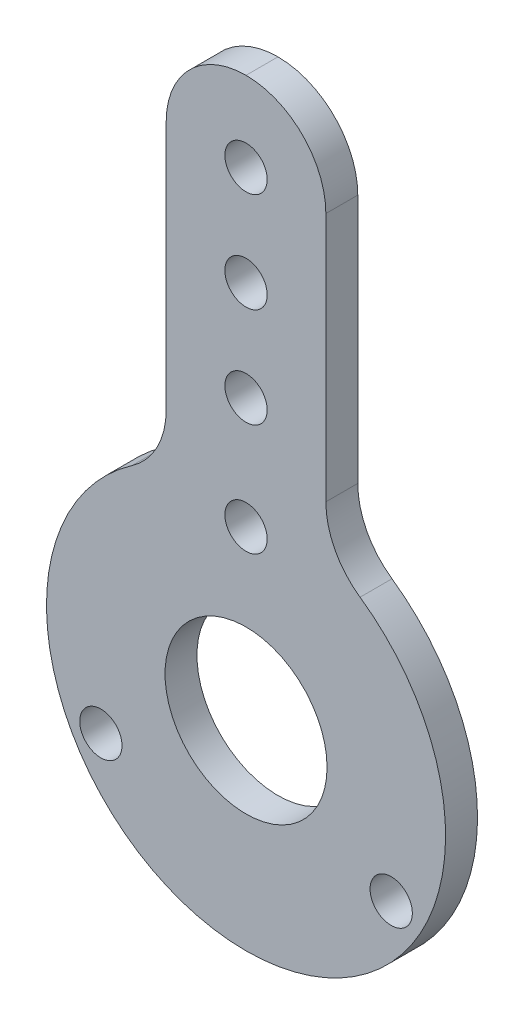
ISO-10303-21;
HEADER;
FILE_DESCRIPTION(('STEP AP214'),'2;1');
FILE_NAME('part.step','',(''),(''),'','','');
FILE_SCHEMA(('AUTOMOTIVE_DESIGN { 1 0 10303 214 1 1 1 1 }'));
ENDSEC;
DATA;
#1=APPLICATION_CONTEXT('core data for automotive mechanical design processes');
#2=APPLICATION_PROTOCOL_DEFINITION('international standard','automotive_design',2000,#1);
#3=PRODUCT_CONTEXT('',#1,'mechanical');
#4=PRODUCT('Part','Part','',(#3));
#5=PRODUCT_RELATED_PRODUCT_CATEGORY('part','',(#4));
#6=PRODUCT_DEFINITION_FORMATION('','',#4);
#7=PRODUCT_DEFINITION_CONTEXT('part definition',#1,'design');
#8=PRODUCT_DEFINITION('design','',#6,#7);
#9=PRODUCT_DEFINITION_SHAPE('','',#8);
#10=(LENGTH_UNIT() NAMED_UNIT(*) SI_UNIT(.MILLI.,.METRE.));
#11=(NAMED_UNIT(*) PLANE_ANGLE_UNIT() SI_UNIT($,.RADIAN.));
#12=(NAMED_UNIT(*) SI_UNIT($,.STERADIAN.) SOLID_ANGLE_UNIT());
#13=UNCERTAINTY_MEASURE_WITH_UNIT(LENGTH_MEASURE(1.E-05),#10,'distance_accuracy_value','');
#14=(GEOMETRIC_REPRESENTATION_CONTEXT(3) GLOBAL_UNCERTAINTY_ASSIGNED_CONTEXT((#13)) GLOBAL_UNIT_ASSIGNED_CONTEXT((#10,
#11,#12)) REPRESENTATION_CONTEXT('',''));
#15=CARTESIAN_POINT('',(0.,0.,0.));
#16=DIRECTION('',(0.,0.,1.));
#17=DIRECTION('',(1.,0.,0.));
#18=AXIS2_PLACEMENT_3D('',#15,#16,#17);
#19=CARTESIAN_POINT('',(0.,0.,4.));
#20=DIRECTION('',(0.,0.,1.));
#21=DIRECTION('',(1.,0.,0.));
#22=AXIS2_PLACEMENT_3D('',#19,#20,#21);
#23=PLANE('',#22);
#24=CARTESIAN_POINT('',(0.,60.,4.));
#25=DIRECTION('',(0.,0.,1.));
#26=DIRECTION('',(1.,0.,0.));
#27=AXIS2_PLACEMENT_3D('',#24,#25,#26);
#28=CIRCLE('',#27,2.65);
#29=CARTESIAN_POINT('',(2.65,60.,4.));
#30=VERTEX_POINT('',#29);
#31=EDGE_CURVE('E188',#30,#30,#28,.T.);
#32=ORIENTED_EDGE('',*,*,#31,.F.);
#33=EDGE_LOOP('',(#32));
#34=FACE_BOUND('',#33,.T.);
#35=CARTESIAN_POINT('',(-18.1865334794719,-10.5000000000007,4.));
#36=DIRECTION('',(0.,0.,1.));
#37=DIRECTION('',(1.,0.,0.));
#38=AXIS2_PLACEMENT_3D('',#35,#36,#37);
#39=CIRCLE('',#38,2.65);
#40=CARTESIAN_POINT('',(-15.5365334794719,-10.5000000000007,4.));
#41=VERTEX_POINT('',#40);
#42=EDGE_CURVE('E176',#41,#41,#39,.T.);
#43=ORIENTED_EDGE('',*,*,#42,.F.);
#44=EDGE_LOOP('',(#43));
#45=FACE_BOUND('',#44,.T.);
#46=CARTESIAN_POINT('',(0.,21.,4.));
#47=DIRECTION('',(0.,0.,1.));
#48=DIRECTION('',(1.,0.,0.));
#49=AXIS2_PLACEMENT_3D('',#46,#47,#48);
#50=CIRCLE('',#49,2.65);
#51=CARTESIAN_POINT('',(2.65,21.,4.));
#52=VERTEX_POINT('',#51);
#53=EDGE_CURVE('E164',#52,#52,#50,.T.);
#54=ORIENTED_EDGE('',*,*,#53,.F.);
#55=EDGE_LOOP('',(#54));
#56=FACE_BOUND('',#55,.T.);
#57=DIRECTION('',(0.,1.,0.));
#58=VECTOR('',#57,1.);
#59=CARTESIAN_POINT('',(10.,70.,4.));
#60=LINE('',#59,#58);
#61=CARTESIAN_POINT('',(10.,28.7228132326901,4.));
#62=VERTEX_POINT('',#61);
#63=CARTESIAN_POINT('',(10.,60.,4.));
#64=VERTEX_POINT('',#63);
#65=EDGE_CURVE('E115',#62,#64,#60,.T.);
#66=ORIENTED_EDGE('',*,*,#65,.T.);
#67=CARTESIAN_POINT('',(0.,60.,4.));
#68=DIRECTION('',(0.,0.,1.));
#69=DIRECTION('',(1.,0.,0.));
#70=AXIS2_PLACEMENT_3D('',#67,#68,#69);
#71=CIRCLE('',#70,10.);
#72=CARTESIAN_POINT('',(0.,70.,4.));
#73=VERTEX_POINT('',#72);
#74=EDGE_CURVE('E140',#64,#73,#71,.T.);
#75=ORIENTED_EDGE('',*,*,#74,.T.);
#76=CARTESIAN_POINT('',(0.,60.,4.));
#77=DIRECTION('',(0.,0.,1.));
#78=DIRECTION('',(1.,0.,0.));
#79=AXIS2_PLACEMENT_3D('',#76,#77,#78);
#80=CIRCLE('',#79,10.);
#81=CARTESIAN_POINT('',(-10.,60.,4.));
#82=VERTEX_POINT('',#81);
#83=EDGE_CURVE('E57',#73,#82,#80,.T.);
#84=ORIENTED_EDGE('',*,*,#83,.T.);
#85=DIRECTION('',(0.,-1.,0.));
#86=VECTOR('',#85,1.);
#87=CARTESIAN_POINT('',(-10.,70.,4.));
#88=LINE('',#87,#86);
#89=CARTESIAN_POINT('',(-10.,28.7228132326901,4.));
#90=VERTEX_POINT('',#89);
#91=EDGE_CURVE('E123',#82,#90,#88,.T.);
#92=ORIENTED_EDGE('',*,*,#91,.T.);
#93=CARTESIAN_POINT('',(-20.,28.7228132326901,4.));
#94=DIRECTION('',(0.,0.,1.));
#95=DIRECTION('',(1.,0.,0.));
#96=AXIS2_PLACEMENT_3D('',#93,#94,#95);
#97=CIRCLE('',#96,10.);
#98=CARTESIAN_POINT('',(-14.2857142857143,20.5162951662073,4.));
#99=VERTEX_POINT('',#98);
#100=EDGE_CURVE('E11',#90,#99,#97,.F.);
#101=ORIENTED_EDGE('',*,*,#100,.T.);
#102=CARTESIAN_POINT('',(0.,0.,4.));
#103=DIRECTION('',(0.,0.,1.));
#104=DIRECTION('',(1.,0.,0.));
#105=AXIS2_PLACEMENT_3D('',#102,#103,#104);
#106=CIRCLE('',#105,25.);
#107=CARTESIAN_POINT('',(14.2857142857143,20.5162951662073,4.));
#108=VERTEX_POINT('',#107);
#109=EDGE_CURVE('E126',#99,#108,#106,.T.);
#110=ORIENTED_EDGE('',*,*,#109,.T.);
#111=CARTESIAN_POINT('',(20.,28.7228132326901,4.));
#112=DIRECTION('',(0.,0.,1.));
#113=DIRECTION('',(1.,0.,0.));
#114=AXIS2_PLACEMENT_3D('',#111,#112,#113);
#115=CIRCLE('',#114,10.);
#116=EDGE_CURVE('E104',#108,#62,#115,.F.);
#117=ORIENTED_EDGE('',*,*,#116,.T.);
#118=EDGE_LOOP('',(#66,#75,#84,#92,#101,#110,#117));
#119=FACE_BOUND('',#118,.T.);
#120=CARTESIAN_POINT('',(0.,0.,4.));
#121=DIRECTION('',(0.,0.,1.));
#122=DIRECTION('',(1.,0.,0.));
#123=AXIS2_PLACEMENT_3D('',#120,#121,#122);
#124=CIRCLE('',#123,10.15);
#125=CARTESIAN_POINT('',(10.15,0.,4.));
#126=VERTEX_POINT('',#125);
#127=EDGE_CURVE('E151',#126,#126,#124,.T.);
#128=ORIENTED_EDGE('',*,*,#127,.F.);
#129=EDGE_LOOP('',(#128));
#130=FACE_BOUND('',#129,.T.);
#131=CARTESIAN_POINT('',(18.1865334794745,-10.4999999999993,4.));
#132=DIRECTION('',(0.,0.,1.));
#133=DIRECTION('',(1.,0.,0.));
#134=AXIS2_PLACEMENT_3D('',#131,#132,#133);
#135=CIRCLE('',#134,2.65);
#136=CARTESIAN_POINT('',(20.8365334794745,-10.4999999999993,4.));
#137=VERTEX_POINT('',#136);
#138=EDGE_CURVE('E170',#137,#137,#135,.T.);
#139=ORIENTED_EDGE('',*,*,#138,.F.);
#140=EDGE_LOOP('',(#139));
#141=FACE_BOUND('',#140,.T.);
#142=CARTESIAN_POINT('',(0.,35.,4.));
#143=DIRECTION('',(0.,0.,1.));
#144=DIRECTION('',(1.,0.,0.));
#145=AXIS2_PLACEMENT_3D('',#142,#143,#144);
#146=CIRCLE('',#145,2.65);
#147=CARTESIAN_POINT('',(2.65,35.,4.));
#148=VERTEX_POINT('',#147);
#149=EDGE_CURVE('E182',#148,#148,#146,.T.);
#150=ORIENTED_EDGE('',*,*,#149,.F.);
#151=EDGE_LOOP('',(#150));
#152=FACE_BOUND('',#151,.T.);
#153=CARTESIAN_POINT('',(0.,47.5,4.));
#154=DIRECTION('',(0.,0.,1.));
#155=DIRECTION('',(1.,0.,0.));
#156=AXIS2_PLACEMENT_3D('',#153,#154,#155);
#157=CIRCLE('',#156,2.65);
#158=CARTESIAN_POINT('',(2.65,47.5,4.));
#159=VERTEX_POINT('',#158);
#160=EDGE_CURVE('E194',#159,#159,#157,.T.);
#161=ORIENTED_EDGE('',*,*,#160,.F.);
#162=EDGE_LOOP('',(#161));
#163=FACE_BOUND('',#162,.T.);
#164=ADVANCED_FACE('F34',(#34,#45,#56,#119,#130,#141,#152,#163),#23,.T.);
#165=CARTESIAN_POINT('',(0.,0.,0.));
#166=DIRECTION('',(0.,0.,1.));
#167=DIRECTION('',(1.,0.,0.));
#168=AXIS2_PLACEMENT_3D('',#165,#166,#167);
#169=PLANE('',#168);
#170=CARTESIAN_POINT('',(0.,60.,0.));
#171=DIRECTION('',(0.,0.,1.));
#172=DIRECTION('',(1.,0.,0.));
#173=AXIS2_PLACEMENT_3D('',#170,#171,#172);
#174=CIRCLE('',#173,10.);
#175=CARTESIAN_POINT('',(-10.,60.,0.));
#176=VERTEX_POINT('',#175);
#177=CARTESIAN_POINT('',(0.,70.,0.));
#178=VERTEX_POINT('',#177);
#179=EDGE_CURVE('E136',#176,#178,#174,.F.);
#180=ORIENTED_EDGE('',*,*,#179,.T.);
#181=CARTESIAN_POINT('',(0.,60.,0.));
#182=DIRECTION('',(0.,0.,1.));
#183=DIRECTION('',(1.,0.,0.));
#184=AXIS2_PLACEMENT_3D('',#181,#182,#183);
#185=CIRCLE('',#184,10.);
#186=CARTESIAN_POINT('',(10.,60.,0.));
#187=VERTEX_POINT('',#186);
#188=EDGE_CURVE('E122',#178,#187,#185,.F.);
#189=ORIENTED_EDGE('',*,*,#188,.T.);
#190=DIRECTION('',(0.,1.,0.));
#191=VECTOR('',#190,1.);
#192=CARTESIAN_POINT('',(10.,70.,0.));
#193=LINE('',#192,#191);
#194=CARTESIAN_POINT('',(10.,28.7228132326901,0.));
#195=VERTEX_POINT('',#194);
#196=EDGE_CURVE('E112',#195,#187,#193,.T.);
#197=ORIENTED_EDGE('',*,*,#196,.F.);
#198=CARTESIAN_POINT('',(20.,28.7228132326901,0.));
#199=DIRECTION('',(0.,0.,1.));
#200=DIRECTION('',(1.,0.,0.));
#201=AXIS2_PLACEMENT_3D('',#198,#199,#200);
#202=CIRCLE('',#201,10.);
#203=CARTESIAN_POINT('',(14.2857142857143,20.5162951662073,0.));
#204=VERTEX_POINT('',#203);
#205=EDGE_CURVE('E94',#195,#204,#202,.T.);
#206=ORIENTED_EDGE('',*,*,#205,.T.);
#207=CARTESIAN_POINT('',(0.,0.,0.));
#208=DIRECTION('',(0.,0.,1.));
#209=DIRECTION('',(1.,0.,0.));
#210=AXIS2_PLACEMENT_3D('',#207,#208,#209);
#211=CIRCLE('',#210,25.);
#212=CARTESIAN_POINT('',(-14.2857142857143,20.5162951662073,0.));
#213=VERTEX_POINT('',#212);
#214=EDGE_CURVE('E124',#213,#204,#211,.T.);
#215=ORIENTED_EDGE('',*,*,#214,.F.);
#216=CARTESIAN_POINT('',(-20.,28.7228132326901,0.));
#217=DIRECTION('',(0.,0.,1.));
#218=DIRECTION('',(1.,0.,0.));
#219=AXIS2_PLACEMENT_3D('',#216,#217,#218);
#220=CIRCLE('',#219,10.);
#221=CARTESIAN_POINT('',(-10.,28.7228132326901,0.));
#222=VERTEX_POINT('',#221);
#223=EDGE_CURVE('E43',#213,#222,#220,.T.);
#224=ORIENTED_EDGE('',*,*,#223,.T.);
#225=DIRECTION('',(0.,-1.,0.));
#226=VECTOR('',#225,1.);
#227=CARTESIAN_POINT('',(-10.,70.,0.));
#228=LINE('',#227,#226);
#229=EDGE_CURVE('E128',#176,#222,#228,.T.);
#230=ORIENTED_EDGE('',*,*,#229,.F.);
#231=EDGE_LOOP('',(#180,#189,#197,#206,#215,#224,#230));
#232=FACE_BOUND('',#231,.T.);
#233=CARTESIAN_POINT('',(0.,0.,0.));
#234=DIRECTION('',(0.,0.,1.));
#235=DIRECTION('',(1.,0.,0.));
#236=AXIS2_PLACEMENT_3D('',#233,#234,#235);
#237=CIRCLE('',#236,10.15);
#238=CARTESIAN_POINT('',(10.15,0.,0.));
#239=VERTEX_POINT('',#238);
#240=EDGE_CURVE('E161',#239,#239,#237,.T.);
#241=ORIENTED_EDGE('',*,*,#240,.T.);
#242=EDGE_LOOP('',(#241));
#243=FACE_BOUND('',#242,.T.);
#244=CARTESIAN_POINT('',(0.,21.,0.));
#245=DIRECTION('',(0.,0.,1.));
#246=DIRECTION('',(1.,0.,0.));
#247=AXIS2_PLACEMENT_3D('',#244,#245,#246);
#248=CIRCLE('',#247,2.65);
#249=CARTESIAN_POINT('',(2.65,21.,0.));
#250=VERTEX_POINT('',#249);
#251=EDGE_CURVE('E167',#250,#250,#248,.T.);
#252=ORIENTED_EDGE('',*,*,#251,.T.);
#253=EDGE_LOOP('',(#252));
#254=FACE_BOUND('',#253,.T.);
#255=CARTESIAN_POINT('',(18.1865334794745,-10.4999999999993,0.));
#256=DIRECTION('',(0.,0.,1.));
#257=DIRECTION('',(1.,0.,0.));
#258=AXIS2_PLACEMENT_3D('',#255,#256,#257);
#259=CIRCLE('',#258,2.65);
#260=CARTESIAN_POINT('',(20.8365334794745,-10.4999999999993,0.));
#261=VERTEX_POINT('',#260);
#262=EDGE_CURVE('E173',#261,#261,#259,.T.);
#263=ORIENTED_EDGE('',*,*,#262,.T.);
#264=EDGE_LOOP('',(#263));
#265=FACE_BOUND('',#264,.T.);
#266=CARTESIAN_POINT('',(-18.1865334794719,-10.5000000000007,0.));
#267=DIRECTION('',(0.,0.,1.));
#268=DIRECTION('',(1.,0.,0.));
#269=AXIS2_PLACEMENT_3D('',#266,#267,#268);
#270=CIRCLE('',#269,2.65);
#271=CARTESIAN_POINT('',(-15.5365334794719,-10.5000000000007,0.));
#272=VERTEX_POINT('',#271);
#273=EDGE_CURVE('E179',#272,#272,#270,.T.);
#274=ORIENTED_EDGE('',*,*,#273,.T.);
#275=EDGE_LOOP('',(#274));
#276=FACE_BOUND('',#275,.T.);
#277=CARTESIAN_POINT('',(0.,35.,0.));
#278=DIRECTION('',(0.,0.,1.));
#279=DIRECTION('',(1.,0.,0.));
#280=AXIS2_PLACEMENT_3D('',#277,#278,#279);
#281=CIRCLE('',#280,2.65);
#282=CARTESIAN_POINT('',(2.65,35.,0.));
#283=VERTEX_POINT('',#282);
#284=EDGE_CURVE('E185',#283,#283,#281,.T.);
#285=ORIENTED_EDGE('',*,*,#284,.T.);
#286=EDGE_LOOP('',(#285));
#287=FACE_BOUND('',#286,.T.);
#288=CARTESIAN_POINT('',(0.,60.,0.));
#289=DIRECTION('',(0.,0.,1.));
#290=DIRECTION('',(1.,0.,0.));
#291=AXIS2_PLACEMENT_3D('',#288,#289,#290);
#292=CIRCLE('',#291,2.65);
#293=CARTESIAN_POINT('',(2.65,60.,0.));
#294=VERTEX_POINT('',#293);
#295=EDGE_CURVE('E191',#294,#294,#292,.T.);
#296=ORIENTED_EDGE('',*,*,#295,.T.);
#297=EDGE_LOOP('',(#296));
#298=FACE_BOUND('',#297,.T.);
#299=CARTESIAN_POINT('',(0.,47.5,0.));
#300=DIRECTION('',(0.,0.,1.));
#301=DIRECTION('',(1.,0.,0.));
#302=AXIS2_PLACEMENT_3D('',#299,#300,#301);
#303=CIRCLE('',#302,2.65);
#304=CARTESIAN_POINT('',(2.65,47.5,0.));
#305=VERTEX_POINT('',#304);
#306=EDGE_CURVE('E197',#305,#305,#303,.T.);
#307=ORIENTED_EDGE('',*,*,#306,.T.);
#308=EDGE_LOOP('',(#307));
#309=FACE_BOUND('',#308,.T.);
#310=ADVANCED_FACE('F119',(#232,#243,#254,#265,#276,#287,#298,#309),#169,.F.);
#311=CARTESIAN_POINT('',(-10.,70.,4.));
#312=DIRECTION('',(1.,0.,0.));
#313=DIRECTION('',(0.,0.,-1.));
#314=AXIS2_PLACEMENT_3D('',#311,#312,#313);
#315=PLANE('',#314);
#316=ORIENTED_EDGE('',*,*,#91,.F.);
#317=DIRECTION('',(0.,0.,-1.));
#318=VECTOR('',#317,1.);
#319=CARTESIAN_POINT('',(-10.,60.,4.));
#320=LINE('',#319,#318);
#321=EDGE_CURVE('E105',#82,#176,#320,.T.);
#322=ORIENTED_EDGE('',*,*,#321,.T.);
#323=ORIENTED_EDGE('',*,*,#229,.T.);
#324=DIRECTION('',(0.,0.,1.));
#325=VECTOR('',#324,1.);
#326=CARTESIAN_POINT('',(-10.,28.7228132326901,4.));
#327=LINE('',#326,#325);
#328=EDGE_CURVE('E50',#222,#90,#327,.T.);
#329=ORIENTED_EDGE('',*,*,#328,.T.);
#330=EDGE_LOOP('',(#316,#322,#323,#329));
#331=FACE_BOUND('',#330,.T.);
#332=ADVANCED_FACE('F149',(#331),#315,.F.);
#333=CARTESIAN_POINT('',(0.,0.,4.));
#334=DIRECTION('',(0.,0.,-1.));
#335=DIRECTION('',(-1.,0.,0.));
#336=AXIS2_PLACEMENT_3D('',#333,#334,#335);
#337=CYLINDRICAL_SURFACE('',#336,25.);
#338=ORIENTED_EDGE('',*,*,#214,.T.);
#339=DIRECTION('',(0.,0.,-1.));
#340=VECTOR('',#339,1.);
#341=CARTESIAN_POINT('',(14.2857142857143,20.5162951662073,4.));
#342=LINE('',#341,#340);
#343=EDGE_CURVE('E99',#204,#108,#342,.F.);
#344=ORIENTED_EDGE('',*,*,#343,.T.);
#345=ORIENTED_EDGE('',*,*,#109,.F.);
#346=DIRECTION('',(0.,0.,-1.));
#347=VECTOR('',#346,1.);
#348=CARTESIAN_POINT('',(-14.2857142857143,20.5162951662073,4.));
#349=LINE('',#348,#347);
#350=EDGE_CURVE('E116',#99,#213,#349,.T.);
#351=ORIENTED_EDGE('',*,*,#350,.T.);
#352=EDGE_LOOP('',(#338,#344,#345,#351));
#353=FACE_BOUND('',#352,.T.);
#354=ADVANCED_FACE('F157',(#353),#337,.T.);
#355=CARTESIAN_POINT('',(10.,70.,4.));
#356=DIRECTION('',(-1.,0.,0.));
#357=DIRECTION('',(0.,0.,1.));
#358=AXIS2_PLACEMENT_3D('',#355,#356,#357);
#359=PLANE('',#358);
#360=ORIENTED_EDGE('',*,*,#65,.F.);
#361=DIRECTION('',(0.,0.,1.));
#362=VECTOR('',#361,1.);
#363=CARTESIAN_POINT('',(10.,28.7228132326901,0.));
#364=LINE('',#363,#362);
#365=EDGE_CURVE('E98',#62,#195,#364,.F.);
#366=ORIENTED_EDGE('',*,*,#365,.T.);
#367=ORIENTED_EDGE('',*,*,#196,.T.);
#368=DIRECTION('',(0.,0.,-1.));
#369=VECTOR('',#368,1.);
#370=CARTESIAN_POINT('',(10.,60.,4.));
#371=LINE('',#370,#369);
#372=EDGE_CURVE('E117',#187,#64,#371,.F.);
#373=ORIENTED_EDGE('',*,*,#372,.T.);
#374=EDGE_LOOP('',(#360,#366,#367,#373));
#375=FACE_BOUND('',#374,.T.);
#376=ADVANCED_FACE('F110',(#375),#359,.F.);
#377=CARTESIAN_POINT('',(0.,0.,4.));
#378=DIRECTION('',(0.,0.,-1.));
#379=DIRECTION('',(-1.,0.,0.));
#380=AXIS2_PLACEMENT_3D('',#377,#378,#379);
#381=CYLINDRICAL_SURFACE('',#380,10.15);
#382=ORIENTED_EDGE('',*,*,#127,.T.);
#383=EDGE_LOOP('',(#382));
#384=FACE_BOUND('',#383,.T.);
#385=ORIENTED_EDGE('',*,*,#240,.F.);
#386=EDGE_LOOP('',(#385));
#387=FACE_BOUND('',#386,.T.);
#388=ADVANCED_FACE('F216',(#384,#387),#381,.F.);
#389=CARTESIAN_POINT('',(0.,21.,4.));
#390=DIRECTION('',(0.,0.,-1.));
#391=DIRECTION('',(-1.,0.,0.));
#392=AXIS2_PLACEMENT_3D('',#389,#390,#391);
#393=CYLINDRICAL_SURFACE('',#392,2.65);
#394=ORIENTED_EDGE('',*,*,#53,.T.);
#395=EDGE_LOOP('',(#394));
#396=FACE_BOUND('',#395,.T.);
#397=ORIENTED_EDGE('',*,*,#251,.F.);
#398=EDGE_LOOP('',(#397));
#399=FACE_BOUND('',#398,.T.);
#400=ADVANCED_FACE('F302',(#396,#399),#393,.F.);
#401=CARTESIAN_POINT('',(18.1865334794745,-10.4999999999993,4.));
#402=DIRECTION('',(0.,0.,-1.));
#403=DIRECTION('',(-1.,0.,0.));
#404=AXIS2_PLACEMENT_3D('',#401,#402,#403);
#405=CYLINDRICAL_SURFACE('',#404,2.65);
#406=ORIENTED_EDGE('',*,*,#138,.T.);
#407=EDGE_LOOP('',(#406));
#408=FACE_BOUND('',#407,.T.);
#409=ORIENTED_EDGE('',*,*,#262,.F.);
#410=EDGE_LOOP('',(#409));
#411=FACE_BOUND('',#410,.T.);
#412=ADVANCED_FACE('F293',(#408,#411),#405,.F.);
#413=CARTESIAN_POINT('',(-18.1865334794719,-10.5000000000007,4.));
#414=DIRECTION('',(0.,0.,-1.));
#415=DIRECTION('',(-1.,0.,0.));
#416=AXIS2_PLACEMENT_3D('',#413,#414,#415);
#417=CYLINDRICAL_SURFACE('',#416,2.65);
#418=ORIENTED_EDGE('',*,*,#42,.T.);
#419=EDGE_LOOP('',(#418));
#420=FACE_BOUND('',#419,.T.);
#421=ORIENTED_EDGE('',*,*,#273,.F.);
#422=EDGE_LOOP('',(#421));
#423=FACE_BOUND('',#422,.T.);
#424=ADVANCED_FACE('F284',(#420,#423),#417,.F.);
#425=CARTESIAN_POINT('',(0.,35.,4.));
#426=DIRECTION('',(0.,0.,-1.));
#427=DIRECTION('',(-1.,0.,0.));
#428=AXIS2_PLACEMENT_3D('',#425,#426,#427);
#429=CYLINDRICAL_SURFACE('',#428,2.65);
#430=ORIENTED_EDGE('',*,*,#149,.T.);
#431=EDGE_LOOP('',(#430));
#432=FACE_BOUND('',#431,.T.);
#433=ORIENTED_EDGE('',*,*,#284,.F.);
#434=EDGE_LOOP('',(#433));
#435=FACE_BOUND('',#434,.T.);
#436=ADVANCED_FACE('F275',(#432,#435),#429,.F.);
#437=CARTESIAN_POINT('',(0.,60.,4.));
#438=DIRECTION('',(0.,0.,-1.));
#439=DIRECTION('',(-1.,0.,0.));
#440=AXIS2_PLACEMENT_3D('',#437,#438,#439);
#441=CYLINDRICAL_SURFACE('',#440,2.65);
#442=ORIENTED_EDGE('',*,*,#31,.T.);
#443=EDGE_LOOP('',(#442));
#444=FACE_BOUND('',#443,.T.);
#445=ORIENTED_EDGE('',*,*,#295,.F.);
#446=EDGE_LOOP('',(#445));
#447=FACE_BOUND('',#446,.T.);
#448=ADVANCED_FACE('F267',(#444,#447),#441,.F.);
#449=CARTESIAN_POINT('',(0.,47.5,4.));
#450=DIRECTION('',(0.,0.,-1.));
#451=DIRECTION('',(-1.,0.,0.));
#452=AXIS2_PLACEMENT_3D('',#449,#450,#451);
#453=CYLINDRICAL_SURFACE('',#452,2.65);
#454=ORIENTED_EDGE('',*,*,#160,.T.);
#455=EDGE_LOOP('',(#454));
#456=FACE_BOUND('',#455,.T.);
#457=ORIENTED_EDGE('',*,*,#306,.F.);
#458=EDGE_LOOP('',(#457));
#459=FACE_BOUND('',#458,.T.);
#460=ADVANCED_FACE('F203',(#456,#459),#453,.F.);
#461=CARTESIAN_POINT('',(20.,28.7228132326901,4.));
#462=DIRECTION('',(0.,0.,-1.));
#463=DIRECTION('',(-1.,0.,0.));
#464=AXIS2_PLACEMENT_3D('',#461,#462,#463);
#465=CYLINDRICAL_SURFACE('',#464,10.);
#466=ORIENTED_EDGE('',*,*,#116,.F.);
#467=ORIENTED_EDGE('',*,*,#343,.F.);
#468=ORIENTED_EDGE('',*,*,#205,.F.);
#469=ORIENTED_EDGE('',*,*,#365,.F.);
#470=EDGE_LOOP('',(#466,#467,#468,#469));
#471=FACE_BOUND('',#470,.T.);
#472=ADVANCED_FACE('F97',(#471),#465,.F.);
#473=CARTESIAN_POINT('',(0.,60.,4.));
#474=DIRECTION('',(0.,0.,-1.));
#475=DIRECTION('',(-1.,0.,0.));
#476=AXIS2_PLACEMENT_3D('',#473,#474,#475);
#477=CYLINDRICAL_SURFACE('',#476,10.);
#478=ORIENTED_EDGE('',*,*,#321,.F.);
#479=ORIENTED_EDGE('',*,*,#83,.F.);
#480=DIRECTION('',(0.,0.,-1.));
#481=VECTOR('',#480,1.);
#482=CARTESIAN_POINT('',(0.,70.,4.));
#483=LINE('',#482,#481);
#484=EDGE_CURVE('E38',#178,#73,#483,.F.);
#485=ORIENTED_EDGE('',*,*,#484,.F.);
#486=ORIENTED_EDGE('',*,*,#179,.F.);
#487=EDGE_LOOP('',(#478,#479,#485,#486));
#488=FACE_BOUND('',#487,.T.);
#489=ADVANCED_FACE('F227',(#488),#477,.T.);
#490=CARTESIAN_POINT('',(0.,60.,4.));
#491=DIRECTION('',(0.,0.,-1.));
#492=DIRECTION('',(-1.,0.,0.));
#493=AXIS2_PLACEMENT_3D('',#490,#491,#492);
#494=CYLINDRICAL_SURFACE('',#493,10.);
#495=ORIENTED_EDGE('',*,*,#74,.F.);
#496=ORIENTED_EDGE('',*,*,#372,.F.);
#497=ORIENTED_EDGE('',*,*,#188,.F.);
#498=ORIENTED_EDGE('',*,*,#484,.T.);
#499=EDGE_LOOP('',(#495,#496,#497,#498));
#500=FACE_BOUND('',#499,.T.);
#501=ADVANCED_FACE('F228',(#500),#494,.T.);
#502=CARTESIAN_POINT('',(-20.,28.7228132326901,4.));
#503=DIRECTION('',(0.,0.,-1.));
#504=DIRECTION('',(-1.,0.,0.));
#505=AXIS2_PLACEMENT_3D('',#502,#503,#504);
#506=CYLINDRICAL_SURFACE('',#505,10.);
#507=ORIENTED_EDGE('',*,*,#100,.F.);
#508=ORIENTED_EDGE('',*,*,#328,.F.);
#509=ORIENTED_EDGE('',*,*,#223,.F.);
#510=ORIENTED_EDGE('',*,*,#350,.F.);
#511=EDGE_LOOP('',(#507,#508,#509,#510));
#512=FACE_BOUND('',#511,.T.);
#513=ADVANCED_FACE('F36',(#512),#506,.F.);
#514=CLOSED_SHELL('',(#164,#310,#332,#354,#376,#388,#400,#412,#424,#436,#448,#460,#472,#489,
#501,#513));
#515=MANIFOLD_SOLID_BREP('B2',#514);
#516=ADVANCED_BREP_SHAPE_REPRESENTATION('',(#18,#515),#14);
#517=SHAPE_DEFINITION_REPRESENTATION(#9,#516);
ENDSEC;
END-ISO-10303-21;
